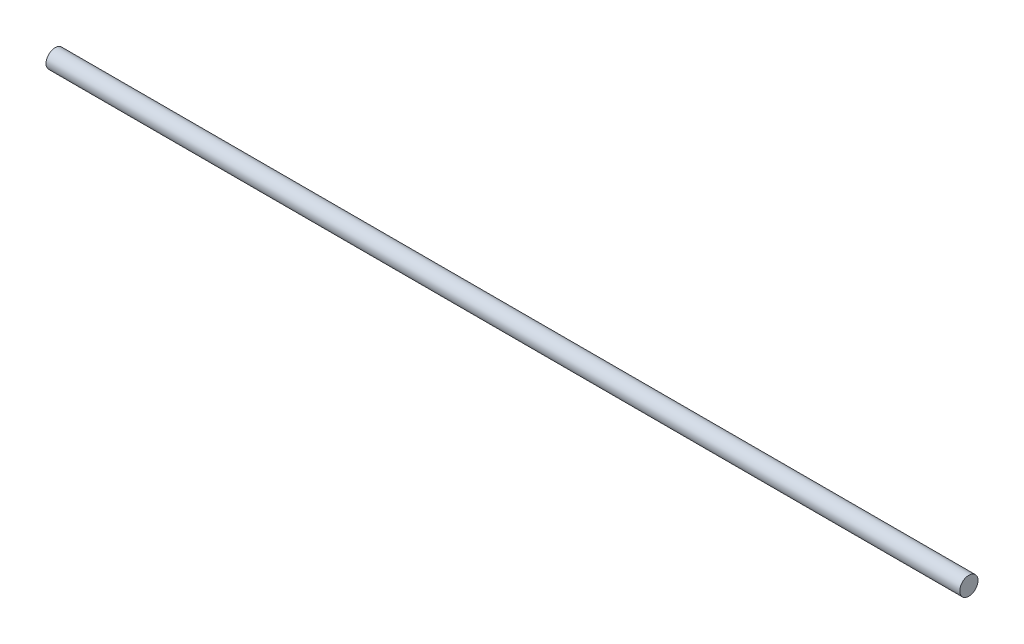
ISO-10303-21;
HEADER;
FILE_DESCRIPTION(('STEP AP214'),'2;1');
FILE_NAME('part.step','',(''),(''),'','','');
FILE_SCHEMA(('AUTOMOTIVE_DESIGN { 1 0 10303 214 1 1 1 1 }'));
ENDSEC;
DATA;
#1=APPLICATION_CONTEXT('core data for automotive mechanical design processes');
#2=APPLICATION_PROTOCOL_DEFINITION('international standard','automotive_design',2000,#1);
#3=PRODUCT_CONTEXT('',#1,'mechanical');
#4=PRODUCT('Part','Part','',(#3));
#5=PRODUCT_RELATED_PRODUCT_CATEGORY('part','',(#4));
#6=PRODUCT_DEFINITION_FORMATION('','',#4);
#7=PRODUCT_DEFINITION_CONTEXT('part definition',#1,'design');
#8=PRODUCT_DEFINITION('design','',#6,#7);
#9=PRODUCT_DEFINITION_SHAPE('','',#8);
#10=(LENGTH_UNIT() NAMED_UNIT(*) SI_UNIT(.MILLI.,.METRE.));
#11=(NAMED_UNIT(*) PLANE_ANGLE_UNIT() SI_UNIT($,.RADIAN.));
#12=(NAMED_UNIT(*) SI_UNIT($,.STERADIAN.) SOLID_ANGLE_UNIT());
#13=UNCERTAINTY_MEASURE_WITH_UNIT(LENGTH_MEASURE(1.E-05),#10,'distance_accuracy_value','');
#14=(GEOMETRIC_REPRESENTATION_CONTEXT(3) GLOBAL_UNCERTAINTY_ASSIGNED_CONTEXT((#13)) GLOBAL_UNIT_ASSIGNED_CONTEXT((#10,
#11,#12)) REPRESENTATION_CONTEXT('',''));
#15=CARTESIAN_POINT('',(0.,0.,0.));
#16=DIRECTION('',(0.,0.,1.));
#17=DIRECTION('',(1.,0.,0.));
#18=AXIS2_PLACEMENT_3D('',#15,#16,#17);
#19=CARTESIAN_POINT('',(76.2,0.,0.));
#20=DIRECTION('',(-1.,0.,0.));
#21=DIRECTION('',(0.,0.,1.));
#22=AXIS2_PLACEMENT_3D('',#19,#20,#21);
#23=CYLINDRICAL_SURFACE('',#22,1.524);
#24=CARTESIAN_POINT('',(76.2,0.,0.));
#25=DIRECTION('',(1.,0.,0.));
#26=DIRECTION('',(0.,0.,-1.));
#27=AXIS2_PLACEMENT_3D('',#24,#25,#26);
#28=CIRCLE('',#27,1.524);
#29=CARTESIAN_POINT('',(76.2,0.,1.524));
#30=VERTEX_POINT('',#29);
#31=EDGE_CURVE('E10',#30,#30,#28,.T.);
#32=CARTESIAN_POINT('',(-76.2,0.,0.));
#33=DIRECTION('',(1.,0.,0.));
#34=DIRECTION('',(0.,0.,-1.));
#35=AXIS2_PLACEMENT_3D('',#32,#33,#34);
#36=CIRCLE('',#35,1.524);
#37=CARTESIAN_POINT('',(-76.2,0.,1.524));
#38=VERTEX_POINT('',#37);
#39=EDGE_CURVE('E37',#38,#38,#36,.T.);
#40=CARTESIAN_POINT('',(76.2,0.,1.524));
#41=CARTESIAN_POINT('',(74.6125,0.,1.524));
#42=CARTESIAN_POINT('',(73.025,0.,1.524));
#43=CARTESIAN_POINT('',(69.85,0.,1.524));
#44=CARTESIAN_POINT('',(68.2625,0.,1.524));
#45=CARTESIAN_POINT('',(65.0875,0.,1.524));
#46=CARTESIAN_POINT('',(63.5,0.,1.524));
#47=CARTESIAN_POINT('',(60.325,0.,1.524));
#48=CARTESIAN_POINT('',(58.7375,0.,1.524));
#49=CARTESIAN_POINT('',(55.5625,0.,1.524));
#50=CARTESIAN_POINT('',(53.975,0.,1.524));
#51=CARTESIAN_POINT('',(50.8,0.,1.524));
#52=CARTESIAN_POINT('',(49.2125,0.,1.524));
#53=CARTESIAN_POINT('',(46.0375,0.,1.524));
#54=CARTESIAN_POINT('',(44.45,0.,1.524));
#55=CARTESIAN_POINT('',(41.275,0.,1.524));
#56=CARTESIAN_POINT('',(39.6875,0.,1.524));
#57=CARTESIAN_POINT('',(36.5125,0.,1.524));
#58=CARTESIAN_POINT('',(34.925,0.,1.524));
#59=CARTESIAN_POINT('',(31.75,0.,1.524));
#60=CARTESIAN_POINT('',(30.1625,0.,1.524));
#61=CARTESIAN_POINT('',(26.9875,0.,1.524));
#62=CARTESIAN_POINT('',(25.4,0.,1.524));
#63=CARTESIAN_POINT('',(22.225,0.,1.524));
#64=CARTESIAN_POINT('',(20.6375,0.,1.524));
#65=CARTESIAN_POINT('',(17.4625,0.,1.524));
#66=CARTESIAN_POINT('',(15.875,0.,1.524));
#67=CARTESIAN_POINT('',(12.7,0.,1.524));
#68=CARTESIAN_POINT('',(11.1125,0.,1.524));
#69=CARTESIAN_POINT('',(7.93749999999999,0.,1.524));
#70=CARTESIAN_POINT('',(6.34999999999999,0.,1.524));
#71=CARTESIAN_POINT('',(3.17499999999999,0.,1.524));
#72=CARTESIAN_POINT('',(1.58749999999999,0.,1.524));
#73=CARTESIAN_POINT('',(-1.58750000000001,0.,1.524));
#74=CARTESIAN_POINT('',(-3.17500000000002,0.,1.524));
#75=CARTESIAN_POINT('',(-6.35000000000002,0.,1.524));
#76=CARTESIAN_POINT('',(-7.93750000000002,0.,1.524));
#77=CARTESIAN_POINT('',(-11.1125,0.,1.524));
#78=CARTESIAN_POINT('',(-12.7,0.,1.524));
#79=CARTESIAN_POINT('',(-15.875,0.,1.524));
#80=CARTESIAN_POINT('',(-17.4625,0.,1.524));
#81=CARTESIAN_POINT('',(-20.6375,0.,1.524));
#82=CARTESIAN_POINT('',(-22.225,0.,1.524));
#83=CARTESIAN_POINT('',(-25.4,0.,1.524));
#84=CARTESIAN_POINT('',(-26.9875,0.,1.524));
#85=CARTESIAN_POINT('',(-30.1625,0.,1.524));
#86=CARTESIAN_POINT('',(-31.75,0.,1.524));
#87=CARTESIAN_POINT('',(-34.925,0.,1.524));
#88=CARTESIAN_POINT('',(-36.5125,0.,1.524));
#89=CARTESIAN_POINT('',(-39.6875,0.,1.524));
#90=CARTESIAN_POINT('',(-41.275,0.,1.524));
#91=CARTESIAN_POINT('',(-44.45,0.,1.524));
#92=CARTESIAN_POINT('',(-46.0375,0.,1.524));
#93=CARTESIAN_POINT('',(-49.2125,0.,1.524));
#94=CARTESIAN_POINT('',(-50.8,0.,1.524));
#95=CARTESIAN_POINT('',(-53.975,0.,1.524));
#96=CARTESIAN_POINT('',(-55.5625,0.,1.524));
#97=CARTESIAN_POINT('',(-58.7375,0.,1.524));
#98=CARTESIAN_POINT('',(-60.325,0.,1.524));
#99=CARTESIAN_POINT('',(-63.5,0.,1.524));
#100=CARTESIAN_POINT('',(-65.0875,0.,1.524));
#101=CARTESIAN_POINT('',(-68.2625,0.,1.524));
#102=CARTESIAN_POINT('',(-69.85,0.,1.524));
#103=CARTESIAN_POINT('',(-73.025,0.,1.524));
#104=CARTESIAN_POINT('',(-74.6125,0.,1.524));
#105=CARTESIAN_POINT('',(-76.2,0.,1.524));
#106=B_SPLINE_CURVE_WITH_KNOTS('',3,(#40,#41,#42,#43,#44,#45,#46,#47,#48,#49,#50,#51,#52,#53,
#54,#55,#56,#57,#58,#59,#60,#61,#62,#63,#64,#65,#66,#67,#68,#69,#70,#71,#72,#73,#74,#75,#76,#77,
#78,#79,#80,#81,#82,#83,#84,#85,#86,#87,#88,#89,#90,#91,#92,#93,#94,#95,#96,#97,#98,#99,#100,
#101,#102,#103,#104,#105),.UNSPECIFIED.,.F.,.F.,(4,2,2,2,2,2,2,2,2,2,2,2,2,2,2,2,2,2,2,2,2,2,2,
2,2,2,2,2,2,2,2,2,4),(0.,4.76249999999999,9.52499999999999,14.2875,19.05,23.8125,28.575,33.3375,
38.1,42.8625,47.625,52.3875,57.15,61.9125,66.675,71.4375,76.2,80.9625,85.725,90.4875,95.25,
100.0125,104.775,109.5375,114.3,119.0625,123.825,128.5875,133.35,138.1125,142.875,147.6375,
152.4),.UNSPECIFIED.);
#107=EDGE_CURVE('BSEAM34',#30,#38,#106,.T.);
#108=ORIENTED_EDGE('',*,*,#31,.F.);
#109=ORIENTED_EDGE('',*,*,#39,.T.);
#110=ORIENTED_EDGE('',*,*,#107,.T.);
#111=ORIENTED_EDGE('',*,*,#107,.F.);
#112=EDGE_LOOP('',(#108,#110,#109,#111));
#113=FACE_BOUND('',#112,.T.);
#114=ADVANCED_FACE('F34',(#113),#23,.T.);
#115=CARTESIAN_POINT('',(76.2,0.,0.));
#116=DIRECTION('',(1.,0.,0.));
#117=DIRECTION('',(0.,0.,-1.));
#118=AXIS2_PLACEMENT_3D('',#115,#116,#117);
#119=PLANE('',#118);
#120=ORIENTED_EDGE('',*,*,#31,.T.);
#121=EDGE_LOOP('',(#120));
#122=FACE_BOUND('',#121,.T.);
#123=ADVANCED_FACE('F49',(#122),#119,.T.);
#124=CARTESIAN_POINT('',(-76.2,0.,0.));
#125=DIRECTION('',(1.,0.,0.));
#126=DIRECTION('',(0.,0.,-1.));
#127=AXIS2_PLACEMENT_3D('',#124,#125,#126);
#128=PLANE('',#127);
#129=ORIENTED_EDGE('',*,*,#39,.F.);
#130=EDGE_LOOP('',(#129));
#131=FACE_BOUND('',#130,.T.);
#132=ADVANCED_FACE('F47',(#131),#128,.F.);
#133=CLOSED_SHELL('',(#114,#123,#132));
#134=MANIFOLD_SOLID_BREP('B2',#133);
#135=ADVANCED_BREP_SHAPE_REPRESENTATION('',(#18,#134),#14);
#136=SHAPE_DEFINITION_REPRESENTATION(#9,#135);
ENDSEC;
END-ISO-10303-21;
